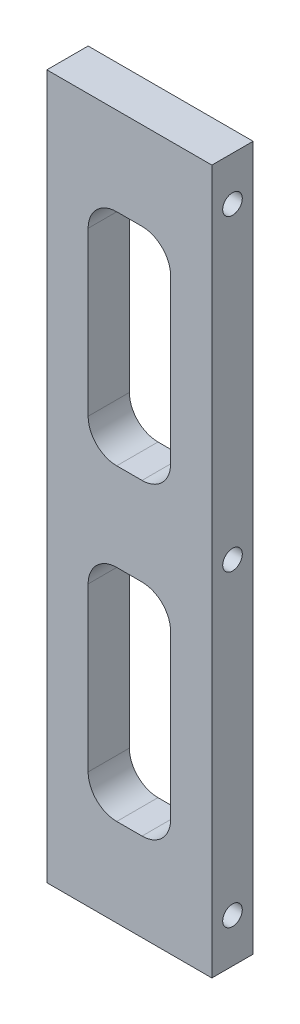
ISO-10303-21;
HEADER;
FILE_DESCRIPTION(('STEP AP214'),'2;1');
FILE_NAME('part.step','',(''),(''),'','','');
FILE_SCHEMA(('AUTOMOTIVE_DESIGN { 1 0 10303 214 1 1 1 1 }'));
ENDSEC;
DATA;
#1=APPLICATION_CONTEXT('core data for automotive mechanical design processes');
#2=APPLICATION_PROTOCOL_DEFINITION('international standard','automotive_design',2000,#1);
#3=PRODUCT_CONTEXT('',#1,'mechanical');
#4=PRODUCT('Part','Part','',(#3));
#5=PRODUCT_RELATED_PRODUCT_CATEGORY('part','',(#4));
#6=PRODUCT_DEFINITION_FORMATION('','',#4);
#7=PRODUCT_DEFINITION_CONTEXT('part definition',#1,'design');
#8=PRODUCT_DEFINITION('design','',#6,#7);
#9=PRODUCT_DEFINITION_SHAPE('','',#8);
#10=(LENGTH_UNIT() NAMED_UNIT(*) SI_UNIT(.MILLI.,.METRE.));
#11=(NAMED_UNIT(*) PLANE_ANGLE_UNIT() SI_UNIT($,.RADIAN.));
#12=(NAMED_UNIT(*) SI_UNIT($,.STERADIAN.) SOLID_ANGLE_UNIT());
#13=UNCERTAINTY_MEASURE_WITH_UNIT(LENGTH_MEASURE(1.E-05),#10,'distance_accuracy_value','');
#14=(GEOMETRIC_REPRESENTATION_CONTEXT(3) GLOBAL_UNCERTAINTY_ASSIGNED_CONTEXT((#13)) GLOBAL_UNIT_ASSIGNED_CONTEXT((#10,
#11,#12)) REPRESENTATION_CONTEXT('',''));
#15=CARTESIAN_POINT('',(0.,0.,0.));
#16=DIRECTION('',(0.,0.,1.));
#17=DIRECTION('',(1.,0.,0.));
#18=AXIS2_PLACEMENT_3D('',#15,#16,#17);
#19=CARTESIAN_POINT('',(9.525,-40.64,4.7625));
#20=DIRECTION('',(-1.,0.,0.));
#21=DIRECTION('',(0.,0.,1.));
#22=AXIS2_PLACEMENT_3D('',#19,#20,#21);
#23=PLANE('',#22);
#24=CARTESIAN_POINT('',(9.525,35.56,2.38125));
#25=DIRECTION('',(1.,0.,0.));
#26=DIRECTION('',(0.,0.,-1.));
#27=AXIS2_PLACEMENT_3D('',#24,#25,#26);
#28=CIRCLE('',#27,1.13029999999999);
#29=CARTESIAN_POINT('',(9.525,35.56,1.25095000000001));
#30=VERTEX_POINT('',#29);
#31=EDGE_CURVE('E423',#30,#30,#28,.T.);
#32=ORIENTED_EDGE('',*,*,#31,.F.);
#33=EDGE_LOOP('',(#32));
#34=FACE_BOUND('',#33,.T.);
#35=CARTESIAN_POINT('',(9.525,0.,2.38125));
#36=DIRECTION('',(1.,0.,0.));
#37=DIRECTION('',(0.,0.,-1.));
#38=AXIS2_PLACEMENT_3D('',#35,#36,#37);
#39=CIRCLE('',#38,1.13029999999999);
#40=CARTESIAN_POINT('',(9.525,0.,1.25095000000001));
#41=VERTEX_POINT('',#40);
#42=EDGE_CURVE('E418',#41,#41,#39,.T.);
#43=ORIENTED_EDGE('',*,*,#42,.F.);
#44=EDGE_LOOP('',(#43));
#45=FACE_BOUND('',#44,.T.);
#46=CARTESIAN_POINT('',(9.525,-35.56,2.38124999999999));
#47=DIRECTION('',(1.,0.,0.));
#48=DIRECTION('',(0.,0.,-1.));
#49=AXIS2_PLACEMENT_3D('',#46,#47,#48);
#50=CIRCLE('',#49,1.13029999999999);
#51=CARTESIAN_POINT('',(9.525,-35.56,1.25095));
#52=VERTEX_POINT('',#51);
#53=EDGE_CURVE('E412',#52,#52,#50,.T.);
#54=ORIENTED_EDGE('',*,*,#53,.F.);
#55=EDGE_LOOP('',(#54));
#56=FACE_BOUND('',#55,.T.);
#57=DIRECTION('',(0.,1.,0.));
#58=VECTOR('',#57,1.);
#59=CARTESIAN_POINT('',(9.525,-40.64,0.));
#60=LINE('',#59,#58);
#61=CARTESIAN_POINT('',(9.525,-40.64,0.));
#62=VERTEX_POINT('',#61);
#63=CARTESIAN_POINT('',(9.525,40.64,0.));
#64=VERTEX_POINT('',#63);
#65=EDGE_CURVE('E196',#62,#64,#60,.T.);
#66=ORIENTED_EDGE('',*,*,#65,.T.);
#67=DIRECTION('',(0.,0.,-1.));
#68=VECTOR('',#67,1.);
#69=CARTESIAN_POINT('',(9.525,40.64,4.7625));
#70=LINE('',#69,#68);
#71=CARTESIAN_POINT('',(9.525,40.64,4.7625));
#72=VERTEX_POINT('',#71);
#73=EDGE_CURVE('E177',#72,#64,#70,.T.);
#74=ORIENTED_EDGE('',*,*,#73,.F.);
#75=DIRECTION('',(0.,1.,0.));
#76=VECTOR('',#75,1.);
#77=CARTESIAN_POINT('',(9.525,-40.64,4.7625));
#78=LINE('',#77,#76);
#79=CARTESIAN_POINT('',(9.525,-40.64,4.7625));
#80=VERTEX_POINT('',#79);
#81=EDGE_CURVE('E184',#80,#72,#78,.T.);
#82=ORIENTED_EDGE('',*,*,#81,.F.);
#83=DIRECTION('',(0.,0.,-1.));
#84=VECTOR('',#83,1.);
#85=CARTESIAN_POINT('',(9.525,-40.64,4.7625));
#86=LINE('',#85,#84);
#87=EDGE_CURVE('E307',#80,#62,#86,.T.);
#88=ORIENTED_EDGE('',*,*,#87,.T.);
#89=EDGE_LOOP('',(#66,#74,#82,#88));
#90=FACE_BOUND('',#89,.T.);
#91=ADVANCED_FACE('F35',(#34,#45,#56,#90),#23,.F.);
#92=CARTESIAN_POINT('',(-9.525,40.64,4.7625));
#93=DIRECTION('',(0.,-1.,0.));
#94=DIRECTION('',(0.,0.,-1.));
#95=AXIS2_PLACEMENT_3D('',#92,#93,#94);
#96=PLANE('',#95);
#97=DIRECTION('',(-1.,0.,0.));
#98=VECTOR('',#97,1.);
#99=CARTESIAN_POINT('',(-9.525,40.64,0.));
#100=LINE('',#99,#98);
#101=CARTESIAN_POINT('',(-9.525,40.64,0.));
#102=VERTEX_POINT('',#101);
#103=EDGE_CURVE('E309',#64,#102,#100,.T.);
#104=ORIENTED_EDGE('',*,*,#103,.T.);
#105=DIRECTION('',(0.,0.,-1.));
#106=VECTOR('',#105,1.);
#107=CARTESIAN_POINT('',(-9.525,40.64,4.7625));
#108=LINE('',#107,#106);
#109=CARTESIAN_POINT('',(-9.525,40.64,4.7625));
#110=VERTEX_POINT('',#109);
#111=EDGE_CURVE('E180',#110,#102,#108,.T.);
#112=ORIENTED_EDGE('',*,*,#111,.F.);
#113=DIRECTION('',(-1.,0.,0.));
#114=VECTOR('',#113,1.);
#115=CARTESIAN_POINT('',(-9.525,40.64,4.7625));
#116=LINE('',#115,#114);
#117=EDGE_CURVE('E173',#72,#110,#116,.T.);
#118=ORIENTED_EDGE('',*,*,#117,.F.);
#119=ORIENTED_EDGE('',*,*,#73,.T.);
#120=EDGE_LOOP('',(#104,#112,#118,#119));
#121=FACE_BOUND('',#120,.T.);
#122=ADVANCED_FACE('F175',(#121),#96,.F.);
#123=CARTESIAN_POINT('',(-9.525,-40.64,4.7625));
#124=DIRECTION('',(1.,0.,0.));
#125=DIRECTION('',(0.,0.,-1.));
#126=AXIS2_PLACEMENT_3D('',#123,#124,#125);
#127=PLANE('',#126);
#128=CARTESIAN_POINT('',(-9.525,35.56,2.38125));
#129=DIRECTION('',(1.,0.,0.));
#130=DIRECTION('',(0.,0.,-1.));
#131=AXIS2_PLACEMENT_3D('',#128,#129,#130);
#132=CIRCLE('',#131,1.13029999999999);
#133=CARTESIAN_POINT('',(-9.525,35.56,1.25095000000001));
#134=VERTEX_POINT('',#133);
#135=EDGE_CURVE('E421',#134,#134,#132,.T.);
#136=ORIENTED_EDGE('',*,*,#135,.T.);
#137=EDGE_LOOP('',(#136));
#138=FACE_BOUND('',#137,.T.);
#139=CARTESIAN_POINT('',(-9.525,0.,2.38125));
#140=DIRECTION('',(1.,0.,0.));
#141=DIRECTION('',(0.,0.,-1.));
#142=AXIS2_PLACEMENT_3D('',#139,#140,#141);
#143=CIRCLE('',#142,1.1303);
#144=CARTESIAN_POINT('',(-9.525,0.,1.25095));
#145=VERTEX_POINT('',#144);
#146=EDGE_CURVE('E415',#145,#145,#143,.T.);
#147=ORIENTED_EDGE('',*,*,#146,.T.);
#148=EDGE_LOOP('',(#147));
#149=FACE_BOUND('',#148,.T.);
#150=CARTESIAN_POINT('',(-9.525,-35.56,2.38124999999999));
#151=DIRECTION('',(1.,0.,0.));
#152=DIRECTION('',(0.,0.,-1.));
#153=AXIS2_PLACEMENT_3D('',#150,#151,#152);
#154=CIRCLE('',#153,1.13029999999999);
#155=CARTESIAN_POINT('',(-9.525,-35.56,1.25095));
#156=VERTEX_POINT('',#155);
#157=EDGE_CURVE('E399',#156,#156,#154,.T.);
#158=ORIENTED_EDGE('',*,*,#157,.T.);
#159=EDGE_LOOP('',(#158));
#160=FACE_BOUND('',#159,.T.);
#161=DIRECTION('',(0.,-1.,0.));
#162=VECTOR('',#161,1.);
#163=CARTESIAN_POINT('',(-9.525,-40.64,0.));
#164=LINE('',#163,#162);
#165=CARTESIAN_POINT('',(-9.525,-40.64,0.));
#166=VERTEX_POINT('',#165);
#167=EDGE_CURVE('E311',#102,#166,#164,.T.);
#168=ORIENTED_EDGE('',*,*,#167,.T.);
#169=DIRECTION('',(0.,0.,-1.));
#170=VECTOR('',#169,1.);
#171=CARTESIAN_POINT('',(-9.525,-40.64,4.7625));
#172=LINE('',#171,#170);
#173=CARTESIAN_POINT('',(-9.525,-40.64,4.7625));
#174=VERTEX_POINT('',#173);
#175=EDGE_CURVE('E201',#174,#166,#172,.T.);
#176=ORIENTED_EDGE('',*,*,#175,.F.);
#177=DIRECTION('',(0.,-1.,0.));
#178=VECTOR('',#177,1.);
#179=CARTESIAN_POINT('',(-9.525,-40.64,4.7625));
#180=LINE('',#179,#178);
#181=EDGE_CURVE('E183',#110,#174,#180,.T.);
#182=ORIENTED_EDGE('',*,*,#181,.F.);
#183=ORIENTED_EDGE('',*,*,#111,.T.);
#184=EDGE_LOOP('',(#168,#176,#182,#183));
#185=FACE_BOUND('',#184,.T.);
#186=ADVANCED_FACE('F321',(#138,#149,#160,#185),#127,.F.);
#187=CARTESIAN_POINT('',(-9.525,-40.64,4.7625));
#188=DIRECTION('',(0.,1.,0.));
#189=DIRECTION('',(0.,0.,1.));
#190=AXIS2_PLACEMENT_3D('',#187,#188,#189);
#191=PLANE('',#190);
#192=DIRECTION('',(1.,0.,0.));
#193=VECTOR('',#192,1.);
#194=CARTESIAN_POINT('',(-9.525,-40.64,0.));
#195=LINE('',#194,#193);
#196=EDGE_CURVE('E193',#166,#62,#195,.T.);
#197=ORIENTED_EDGE('',*,*,#196,.T.);
#198=ORIENTED_EDGE('',*,*,#87,.F.);
#199=DIRECTION('',(1.,0.,0.));
#200=VECTOR('',#199,1.);
#201=CARTESIAN_POINT('',(-9.525,-40.64,4.7625));
#202=LINE('',#201,#200);
#203=EDGE_CURVE('E189',#174,#80,#202,.T.);
#204=ORIENTED_EDGE('',*,*,#203,.F.);
#205=ORIENTED_EDGE('',*,*,#175,.T.);
#206=EDGE_LOOP('',(#197,#198,#204,#205));
#207=FACE_BOUND('',#206,.T.);
#208=ADVANCED_FACE('F318',(#207),#191,.F.);
#209=CARTESIAN_POINT('',(0.,0.,4.7625));
#210=DIRECTION('',(0.,0.,-1.));
#211=DIRECTION('',(-1.,0.,0.));
#212=AXIS2_PLACEMENT_3D('',#209,#210,#211);
#213=PLANE('',#212);
#214=DIRECTION('',(1.,0.,0.));
#215=VECTOR('',#214,1.);
#216=CARTESIAN_POINT('',(-4.7625,-30.48,4.7625));
#217=LINE('',#216,#215);
#218=CARTESIAN_POINT('',(-1.4605,-30.48,4.7625));
#219=VERTEX_POINT('',#218);
#220=CARTESIAN_POINT('',(1.4605,-30.48,4.7625));
#221=VERTEX_POINT('',#220);
#222=EDGE_CURVE('E393',#219,#221,#217,.T.);
#223=ORIENTED_EDGE('',*,*,#222,.F.);
#224=CARTESIAN_POINT('',(-1.4605,-27.178,4.7625));
#225=DIRECTION('',(0.,0.,-1.));
#226=DIRECTION('',(-1.,0.,0.));
#227=AXIS2_PLACEMENT_3D('',#224,#225,#226);
#228=CIRCLE('',#227,3.302);
#229=CARTESIAN_POINT('',(-4.7625,-27.178,4.7625));
#230=VERTEX_POINT('',#229);
#231=EDGE_CURVE('E241',#219,#230,#228,.T.);
#232=ORIENTED_EDGE('',*,*,#231,.T.);
#233=DIRECTION('',(0.,-1.,0.));
#234=VECTOR('',#233,1.);
#235=CARTESIAN_POINT('',(-4.7625,-5.08,4.7625));
#236=LINE('',#235,#234);
#237=CARTESIAN_POINT('',(-4.7625,-8.382,4.7625));
#238=VERTEX_POINT('',#237);
#239=EDGE_CURVE('E396',#238,#230,#236,.T.);
#240=ORIENTED_EDGE('',*,*,#239,.F.);
#241=CARTESIAN_POINT('',(-1.4605,-8.382,4.7625));
#242=DIRECTION('',(0.,0.,-1.));
#243=DIRECTION('',(-1.,0.,0.));
#244=AXIS2_PLACEMENT_3D('',#241,#242,#243);
#245=CIRCLE('',#244,3.302);
#246=CARTESIAN_POINT('',(-1.4605,-5.08,4.7625));
#247=VERTEX_POINT('',#246);
#248=EDGE_CURVE('E249',#238,#247,#245,.T.);
#249=ORIENTED_EDGE('',*,*,#248,.T.);
#250=DIRECTION('',(-1.,0.,0.));
#251=VECTOR('',#250,1.);
#252=CARTESIAN_POINT('',(-4.7625,-5.08,4.7625));
#253=LINE('',#252,#251);
#254=CARTESIAN_POINT('',(1.4605,-5.08,4.7625));
#255=VERTEX_POINT('',#254);
#256=EDGE_CURVE('E386',#255,#247,#253,.T.);
#257=ORIENTED_EDGE('',*,*,#256,.F.);
#258=CARTESIAN_POINT('',(1.4605,-8.382,4.7625));
#259=DIRECTION('',(0.,0.,-1.));
#260=DIRECTION('',(-1.,0.,0.));
#261=AXIS2_PLACEMENT_3D('',#258,#259,#260);
#262=CIRCLE('',#261,3.302);
#263=CARTESIAN_POINT('',(4.7625,-8.382,4.7625));
#264=VERTEX_POINT('',#263);
#265=EDGE_CURVE('E253',#255,#264,#262,.T.);
#266=ORIENTED_EDGE('',*,*,#265,.T.);
#267=DIRECTION('',(0.,1.,0.));
#268=VECTOR('',#267,1.);
#269=CARTESIAN_POINT('',(4.7625,-5.08,4.7625));
#270=LINE('',#269,#268);
#271=CARTESIAN_POINT('',(4.7625,-27.178,4.7625));
#272=VERTEX_POINT('',#271);
#273=EDGE_CURVE('E390',#272,#264,#270,.T.);
#274=ORIENTED_EDGE('',*,*,#273,.F.);
#275=CARTESIAN_POINT('',(1.4605,-27.178,4.7625));
#276=DIRECTION('',(0.,0.,-1.));
#277=DIRECTION('',(-1.,0.,0.));
#278=AXIS2_PLACEMENT_3D('',#275,#276,#277);
#279=CIRCLE('',#278,3.302);
#280=EDGE_CURVE('E245',#272,#221,#279,.T.);
#281=ORIENTED_EDGE('',*,*,#280,.T.);
#282=EDGE_LOOP('',(#223,#232,#240,#249,#257,#266,#274,#281));
#283=FACE_BOUND('',#282,.T.);
#284=DIRECTION('',(-1.,0.,0.));
#285=VECTOR('',#284,1.);
#286=CARTESIAN_POINT('',(-4.7625,30.48,4.7625));
#287=LINE('',#286,#285);
#288=CARTESIAN_POINT('',(1.4605,30.48,4.7625));
#289=VERTEX_POINT('',#288);
#290=CARTESIAN_POINT('',(-1.4605,30.48,4.7625));
#291=VERTEX_POINT('',#290);
#292=EDGE_CURVE('E270',#289,#291,#287,.T.);
#293=ORIENTED_EDGE('',*,*,#292,.F.);
#294=CARTESIAN_POINT('',(1.4605,27.178,4.7625));
#295=DIRECTION('',(0.,0.,-1.));
#296=DIRECTION('',(-1.,0.,0.));
#297=AXIS2_PLACEMENT_3D('',#294,#295,#296);
#298=CIRCLE('',#297,3.302);
#299=CARTESIAN_POINT('',(4.7625,27.178,4.7625));
#300=VERTEX_POINT('',#299);
#301=EDGE_CURVE('E265',#289,#300,#298,.T.);
#302=ORIENTED_EDGE('',*,*,#301,.T.);
#303=DIRECTION('',(0.,1.,0.));
#304=VECTOR('',#303,1.);
#305=CARTESIAN_POINT('',(4.7625,5.08,4.7625));
#306=LINE('',#305,#304);
#307=CARTESIAN_POINT('',(4.7625,8.382,4.7625));
#308=VERTEX_POINT('',#307);
#309=EDGE_CURVE('E277',#308,#300,#306,.T.);
#310=ORIENTED_EDGE('',*,*,#309,.F.);
#311=CARTESIAN_POINT('',(1.4605,8.382,4.7625));
#312=DIRECTION('',(0.,0.,-1.));
#313=DIRECTION('',(-1.,0.,0.));
#314=AXIS2_PLACEMENT_3D('',#311,#312,#313);
#315=CIRCLE('',#314,3.302);
#316=CARTESIAN_POINT('',(1.4605,5.08,4.7625));
#317=VERTEX_POINT('',#316);
#318=EDGE_CURVE('E261',#308,#317,#315,.T.);
#319=ORIENTED_EDGE('',*,*,#318,.T.);
#320=DIRECTION('',(1.,0.,0.));
#321=VECTOR('',#320,1.);
#322=CARTESIAN_POINT('',(-4.7625,5.08,4.7625));
#323=LINE('',#322,#321);
#324=CARTESIAN_POINT('',(-1.4605,5.08,4.7625));
#325=VERTEX_POINT('',#324);
#326=EDGE_CURVE('E302',#325,#317,#323,.T.);
#327=ORIENTED_EDGE('',*,*,#326,.F.);
#328=CARTESIAN_POINT('',(-1.4605,8.382,4.7625));
#329=DIRECTION('',(0.,0.,-1.));
#330=DIRECTION('',(-1.,0.,0.));
#331=AXIS2_PLACEMENT_3D('',#328,#329,#330);
#332=CIRCLE('',#331,3.302);
#333=CARTESIAN_POINT('',(-4.7625,8.382,4.7625));
#334=VERTEX_POINT('',#333);
#335=EDGE_CURVE('E257',#325,#334,#332,.T.);
#336=ORIENTED_EDGE('',*,*,#335,.T.);
#337=DIRECTION('',(0.,-1.,0.));
#338=VECTOR('',#337,1.);
#339=CARTESIAN_POINT('',(-4.7625,5.08,4.7625));
#340=LINE('',#339,#338);
#341=CARTESIAN_POINT('',(-4.7625,27.178,4.7625));
#342=VERTEX_POINT('',#341);
#343=EDGE_CURVE('E272',#342,#334,#340,.T.);
#344=ORIENTED_EDGE('',*,*,#343,.F.);
#345=CARTESIAN_POINT('',(-1.4605,27.178,4.7625));
#346=DIRECTION('',(0.,0.,-1.));
#347=DIRECTION('',(-1.,0.,0.));
#348=AXIS2_PLACEMENT_3D('',#345,#346,#347);
#349=CIRCLE('',#348,3.302);
#350=EDGE_CURVE('E43',#342,#291,#349,.T.);
#351=ORIENTED_EDGE('',*,*,#350,.T.);
#352=EDGE_LOOP('',(#293,#302,#310,#319,#327,#336,#344,#351));
#353=FACE_BOUND('',#352,.T.);
#354=ORIENTED_EDGE('',*,*,#81,.T.);
#355=ORIENTED_EDGE('',*,*,#117,.T.);
#356=ORIENTED_EDGE('',*,*,#181,.T.);
#357=ORIENTED_EDGE('',*,*,#203,.T.);
#358=EDGE_LOOP('',(#354,#355,#356,#357));
#359=FACE_BOUND('',#358,.T.);
#360=ADVANCED_FACE('F187',(#283,#353,#359),#213,.F.);
#361=CARTESIAN_POINT('',(0.,0.,0.));
#362=DIRECTION('',(0.,0.,-1.));
#363=DIRECTION('',(-1.,0.,0.));
#364=AXIS2_PLACEMENT_3D('',#361,#362,#363);
#365=PLANE('',#364);
#366=DIRECTION('',(-1.,0.,0.));
#367=VECTOR('',#366,1.);
#368=CARTESIAN_POINT('',(-4.7625,-5.08,0.));
#369=LINE('',#368,#367);
#370=CARTESIAN_POINT('',(1.4605,-5.08,0.));
#371=VERTEX_POINT('',#370);
#372=CARTESIAN_POINT('',(-1.4605,-5.08,0.));
#373=VERTEX_POINT('',#372);
#374=EDGE_CURVE('E299',#371,#373,#369,.T.);
#375=ORIENTED_EDGE('',*,*,#374,.T.);
#376=CARTESIAN_POINT('',(-1.4605,-8.382,0.));
#377=DIRECTION('',(0.,0.,-1.));
#378=DIRECTION('',(-1.,0.,0.));
#379=AXIS2_PLACEMENT_3D('',#376,#377,#378);
#380=CIRCLE('',#379,3.302);
#381=CARTESIAN_POINT('',(-4.7625,-8.382,0.));
#382=VERTEX_POINT('',#381);
#383=EDGE_CURVE('E251',#373,#382,#380,.F.);
#384=ORIENTED_EDGE('',*,*,#383,.T.);
#385=DIRECTION('',(0.,-1.,0.));
#386=VECTOR('',#385,1.);
#387=CARTESIAN_POINT('',(-4.7625,-5.08,0.));
#388=LINE('',#387,#386);
#389=CARTESIAN_POINT('',(-4.7625,-27.178,0.));
#390=VERTEX_POINT('',#389);
#391=EDGE_CURVE('E389',#382,#390,#388,.T.);
#392=ORIENTED_EDGE('',*,*,#391,.T.);
#393=CARTESIAN_POINT('',(-1.4605,-27.178,0.));
#394=DIRECTION('',(0.,0.,-1.));
#395=DIRECTION('',(-1.,0.,0.));
#396=AXIS2_PLACEMENT_3D('',#393,#394,#395);
#397=CIRCLE('',#396,3.302);
#398=CARTESIAN_POINT('',(-1.4605,-30.48,0.));
#399=VERTEX_POINT('',#398);
#400=EDGE_CURVE('E243',#390,#399,#397,.F.);
#401=ORIENTED_EDGE('',*,*,#400,.T.);
#402=DIRECTION('',(1.,0.,0.));
#403=VECTOR('',#402,1.);
#404=CARTESIAN_POINT('',(-4.7625,-30.48,0.));
#405=LINE('',#404,#403);
#406=CARTESIAN_POINT('',(1.4605,-30.48,0.));
#407=VERTEX_POINT('',#406);
#408=EDGE_CURVE('E405',#399,#407,#405,.T.);
#409=ORIENTED_EDGE('',*,*,#408,.T.);
#410=CARTESIAN_POINT('',(1.4605,-27.178,0.));
#411=DIRECTION('',(0.,0.,-1.));
#412=DIRECTION('',(-1.,0.,0.));
#413=AXIS2_PLACEMENT_3D('',#410,#411,#412);
#414=CIRCLE('',#413,3.302);
#415=CARTESIAN_POINT('',(4.7625,-27.178,0.));
#416=VERTEX_POINT('',#415);
#417=EDGE_CURVE('E247',#407,#416,#414,.F.);
#418=ORIENTED_EDGE('',*,*,#417,.T.);
#419=DIRECTION('',(0.,1.,0.));
#420=VECTOR('',#419,1.);
#421=CARTESIAN_POINT('',(4.7625,-5.08,0.));
#422=LINE('',#421,#420);
#423=CARTESIAN_POINT('',(4.7625,-8.382,0.));
#424=VERTEX_POINT('',#423);
#425=EDGE_CURVE('E402',#416,#424,#422,.T.);
#426=ORIENTED_EDGE('',*,*,#425,.T.);
#427=CARTESIAN_POINT('',(1.4605,-8.382,0.));
#428=DIRECTION('',(0.,0.,-1.));
#429=DIRECTION('',(-1.,0.,0.));
#430=AXIS2_PLACEMENT_3D('',#427,#428,#429);
#431=CIRCLE('',#430,3.302);
#432=EDGE_CURVE('E255',#424,#371,#431,.F.);
#433=ORIENTED_EDGE('',*,*,#432,.T.);
#434=EDGE_LOOP('',(#375,#384,#392,#401,#409,#418,#426,#433));
#435=FACE_BOUND('',#434,.T.);
#436=DIRECTION('',(1.,0.,0.));
#437=VECTOR('',#436,1.);
#438=CARTESIAN_POINT('',(-4.7625,5.08,0.));
#439=LINE('',#438,#437);
#440=CARTESIAN_POINT('',(-1.4605,5.08,0.));
#441=VERTEX_POINT('',#440);
#442=CARTESIAN_POINT('',(1.4605,5.08,0.));
#443=VERTEX_POINT('',#442);
#444=EDGE_CURVE('E291',#441,#443,#439,.T.);
#445=ORIENTED_EDGE('',*,*,#444,.T.);
#446=CARTESIAN_POINT('',(1.4605,8.382,0.));
#447=DIRECTION('',(0.,0.,-1.));
#448=DIRECTION('',(-1.,0.,0.));
#449=AXIS2_PLACEMENT_3D('',#446,#447,#448);
#450=CIRCLE('',#449,3.302);
#451=CARTESIAN_POINT('',(4.7625,8.382,0.));
#452=VERTEX_POINT('',#451);
#453=EDGE_CURVE('E263',#443,#452,#450,.F.);
#454=ORIENTED_EDGE('',*,*,#453,.T.);
#455=DIRECTION('',(0.,1.,0.));
#456=VECTOR('',#455,1.);
#457=CARTESIAN_POINT('',(4.7625,5.08,0.));
#458=LINE('',#457,#456);
#459=CARTESIAN_POINT('',(4.7625,27.178,0.));
#460=VERTEX_POINT('',#459);
#461=EDGE_CURVE('E294',#452,#460,#458,.T.);
#462=ORIENTED_EDGE('',*,*,#461,.T.);
#463=CARTESIAN_POINT('',(1.4605,27.178,0.));
#464=DIRECTION('',(0.,0.,-1.));
#465=DIRECTION('',(-1.,0.,0.));
#466=AXIS2_PLACEMENT_3D('',#463,#464,#465);
#467=CIRCLE('',#466,3.302);
#468=CARTESIAN_POINT('',(1.4605,30.48,0.));
#469=VERTEX_POINT('',#468);
#470=EDGE_CURVE('E57',#460,#469,#467,.F.);
#471=ORIENTED_EDGE('',*,*,#470,.T.);
#472=DIRECTION('',(-1.,0.,0.));
#473=VECTOR('',#472,1.);
#474=CARTESIAN_POINT('',(-4.7625,30.48,0.));
#475=LINE('',#474,#473);
#476=CARTESIAN_POINT('',(-1.4605,30.48,0.));
#477=VERTEX_POINT('',#476);
#478=EDGE_CURVE('E287',#469,#477,#475,.T.);
#479=ORIENTED_EDGE('',*,*,#478,.T.);
#480=CARTESIAN_POINT('',(-1.4605,27.178,0.));
#481=DIRECTION('',(0.,0.,-1.));
#482=DIRECTION('',(-1.,0.,0.));
#483=AXIS2_PLACEMENT_3D('',#480,#481,#482);
#484=CIRCLE('',#483,3.302);
#485=CARTESIAN_POINT('',(-4.7625,27.178,0.));
#486=VERTEX_POINT('',#485);
#487=EDGE_CURVE('E11',#477,#486,#484,.F.);
#488=ORIENTED_EDGE('',*,*,#487,.T.);
#489=DIRECTION('',(0.,-1.,0.));
#490=VECTOR('',#489,1.);
#491=CARTESIAN_POINT('',(-4.7625,5.08,0.));
#492=LINE('',#491,#490);
#493=CARTESIAN_POINT('',(-4.7625,8.382,0.));
#494=VERTEX_POINT('',#493);
#495=EDGE_CURVE('E285',#486,#494,#492,.T.);
#496=ORIENTED_EDGE('',*,*,#495,.T.);
#497=CARTESIAN_POINT('',(-1.4605,8.382,0.));
#498=DIRECTION('',(0.,0.,-1.));
#499=DIRECTION('',(-1.,0.,0.));
#500=AXIS2_PLACEMENT_3D('',#497,#498,#499);
#501=CIRCLE('',#500,3.302);
#502=EDGE_CURVE('E259',#494,#441,#501,.F.);
#503=ORIENTED_EDGE('',*,*,#502,.T.);
#504=EDGE_LOOP('',(#445,#454,#462,#471,#479,#488,#496,#503));
#505=FACE_BOUND('',#504,.T.);
#506=ORIENTED_EDGE('',*,*,#65,.F.);
#507=ORIENTED_EDGE('',*,*,#196,.F.);
#508=ORIENTED_EDGE('',*,*,#167,.F.);
#509=ORIENTED_EDGE('',*,*,#103,.F.);
#510=EDGE_LOOP('',(#506,#507,#508,#509));
#511=FACE_BOUND('',#510,.T.);
#512=ADVANCED_FACE('F283',(#435,#505,#511),#365,.T.);
#513=CARTESIAN_POINT('',(4.7625,5.08,0.));
#514=DIRECTION('',(1.,0.,0.));
#515=DIRECTION('',(0.,0.,-1.));
#516=AXIS2_PLACEMENT_3D('',#513,#514,#515);
#517=PLANE('',#516);
#518=ORIENTED_EDGE('',*,*,#461,.F.);
#519=DIRECTION('',(0.,0.,1.));
#520=VECTOR('',#519,1.);
#521=CARTESIAN_POINT('',(4.7625,8.382,4.7625));
#522=LINE('',#521,#520);
#523=EDGE_CURVE('E234',#452,#308,#522,.T.);
#524=ORIENTED_EDGE('',*,*,#523,.T.);
#525=ORIENTED_EDGE('',*,*,#309,.T.);
#526=DIRECTION('',(0.,0.,1.));
#527=VECTOR('',#526,1.);
#528=CARTESIAN_POINT('',(4.7625,27.178,0.));
#529=LINE('',#528,#527);
#530=EDGE_CURVE('E232',#300,#460,#529,.F.);
#531=ORIENTED_EDGE('',*,*,#530,.T.);
#532=EDGE_LOOP('',(#518,#524,#525,#531));
#533=FACE_BOUND('',#532,.T.);
#534=ADVANCED_FACE('F376',(#533),#517,.F.);
#535=CARTESIAN_POINT('',(-4.7625,5.08,0.));
#536=DIRECTION('',(0.,-1.,0.));
#537=DIRECTION('',(0.,0.,-1.));
#538=AXIS2_PLACEMENT_3D('',#535,#536,#537);
#539=PLANE('',#538);
#540=ORIENTED_EDGE('',*,*,#444,.F.);
#541=DIRECTION('',(0.,0.,1.));
#542=VECTOR('',#541,1.);
#543=CARTESIAN_POINT('',(-1.4605,5.08,4.7625));
#544=LINE('',#543,#542);
#545=EDGE_CURVE('E224',#441,#325,#544,.T.);
#546=ORIENTED_EDGE('',*,*,#545,.T.);
#547=ORIENTED_EDGE('',*,*,#326,.T.);
#548=DIRECTION('',(0.,0.,1.));
#549=VECTOR('',#548,1.);
#550=CARTESIAN_POINT('',(1.4605,5.08,0.));
#551=LINE('',#550,#549);
#552=EDGE_CURVE('E222',#317,#443,#551,.F.);
#553=ORIENTED_EDGE('',*,*,#552,.T.);
#554=EDGE_LOOP('',(#540,#546,#547,#553));
#555=FACE_BOUND('',#554,.T.);
#556=ADVANCED_FACE('F383',(#555),#539,.F.);
#557=CARTESIAN_POINT('',(-4.7625,5.08,0.));
#558=DIRECTION('',(-1.,0.,0.));
#559=DIRECTION('',(0.,-1.,0.));
#560=AXIS2_PLACEMENT_3D('',#557,#558,#559);
#561=PLANE('',#560);
#562=ORIENTED_EDGE('',*,*,#343,.T.);
#563=DIRECTION('',(0.,0.,1.));
#564=VECTOR('',#563,1.);
#565=CARTESIAN_POINT('',(-4.7625,8.382,0.));
#566=LINE('',#565,#564);
#567=EDGE_CURVE('E230',#334,#494,#566,.F.);
#568=ORIENTED_EDGE('',*,*,#567,.T.);
#569=ORIENTED_EDGE('',*,*,#495,.F.);
#570=DIRECTION('',(0.,0.,1.));
#571=VECTOR('',#570,1.);
#572=CARTESIAN_POINT('',(-4.7625,27.178,4.7625));
#573=LINE('',#572,#571);
#574=EDGE_CURVE('E227',#486,#342,#573,.T.);
#575=ORIENTED_EDGE('',*,*,#574,.T.);
#576=EDGE_LOOP('',(#562,#568,#569,#575));
#577=FACE_BOUND('',#576,.T.);
#578=ADVANCED_FACE('F289',(#577),#561,.F.);
#579=CARTESIAN_POINT('',(-4.7625,30.48,0.));
#580=DIRECTION('',(0.,1.,0.));
#581=DIRECTION('',(0.,0.,1.));
#582=AXIS2_PLACEMENT_3D('',#579,#580,#581);
#583=PLANE('',#582);
#584=ORIENTED_EDGE('',*,*,#478,.F.);
#585=DIRECTION('',(0.,0.,1.));
#586=VECTOR('',#585,1.);
#587=CARTESIAN_POINT('',(1.4605,30.48,4.7625));
#588=LINE('',#587,#586);
#589=EDGE_CURVE('E238',#469,#289,#588,.T.);
#590=ORIENTED_EDGE('',*,*,#589,.T.);
#591=ORIENTED_EDGE('',*,*,#292,.T.);
#592=DIRECTION('',(0.,0.,1.));
#593=VECTOR('',#592,1.);
#594=CARTESIAN_POINT('',(-1.4605,30.48,0.));
#595=LINE('',#594,#593);
#596=EDGE_CURVE('E50',#291,#477,#595,.F.);
#597=ORIENTED_EDGE('',*,*,#596,.T.);
#598=EDGE_LOOP('',(#584,#590,#591,#597));
#599=FACE_BOUND('',#598,.T.);
#600=ADVANCED_FACE('F275',(#599),#583,.F.);
#601=CARTESIAN_POINT('',(-4.7625,-5.08,0.));
#602=DIRECTION('',(-1.,0.,0.));
#603=DIRECTION('',(0.,-1.,0.));
#604=AXIS2_PLACEMENT_3D('',#601,#602,#603);
#605=PLANE('',#604);
#606=ORIENTED_EDGE('',*,*,#239,.T.);
#607=DIRECTION('',(0.,0.,1.));
#608=VECTOR('',#607,1.);
#609=CARTESIAN_POINT('',(-4.7625,-27.178,0.));
#610=LINE('',#609,#608);
#611=EDGE_CURVE('E210',#230,#390,#610,.F.);
#612=ORIENTED_EDGE('',*,*,#611,.T.);
#613=ORIENTED_EDGE('',*,*,#391,.F.);
#614=DIRECTION('',(0.,0.,1.));
#615=VECTOR('',#614,1.);
#616=CARTESIAN_POINT('',(-4.7625,-8.382,4.7625));
#617=LINE('',#616,#615);
#618=EDGE_CURVE('E207',#382,#238,#617,.T.);
#619=ORIENTED_EDGE('',*,*,#618,.T.);
#620=EDGE_LOOP('',(#606,#612,#613,#619));
#621=FACE_BOUND('',#620,.T.);
#622=ADVANCED_FACE('F445',(#621),#605,.F.);
#623=CARTESIAN_POINT('',(-4.7625,-5.08,0.));
#624=DIRECTION('',(0.,1.,0.));
#625=DIRECTION('',(0.,0.,1.));
#626=AXIS2_PLACEMENT_3D('',#623,#624,#625);
#627=PLANE('',#626);
#628=ORIENTED_EDGE('',*,*,#256,.T.);
#629=DIRECTION('',(0.,0.,1.));
#630=VECTOR('',#629,1.);
#631=CARTESIAN_POINT('',(-1.4605,-5.08,0.));
#632=LINE('',#631,#630);
#633=EDGE_CURVE('E220',#247,#373,#632,.F.);
#634=ORIENTED_EDGE('',*,*,#633,.T.);
#635=ORIENTED_EDGE('',*,*,#374,.F.);
#636=DIRECTION('',(0.,0.,1.));
#637=VECTOR('',#636,1.);
#638=CARTESIAN_POINT('',(1.4605,-5.08,4.7625));
#639=LINE('',#638,#637);
#640=EDGE_CURVE('E217',#371,#255,#639,.T.);
#641=ORIENTED_EDGE('',*,*,#640,.T.);
#642=EDGE_LOOP('',(#628,#634,#635,#641));
#643=FACE_BOUND('',#642,.T.);
#644=ADVANCED_FACE('F441',(#643),#627,.F.);
#645=CARTESIAN_POINT('',(4.7625,-5.08,0.));
#646=DIRECTION('',(1.,0.,0.));
#647=DIRECTION('',(0.,0.,-1.));
#648=AXIS2_PLACEMENT_3D('',#645,#646,#647);
#649=PLANE('',#648);
#650=ORIENTED_EDGE('',*,*,#425,.F.);
#651=DIRECTION('',(0.,0.,1.));
#652=VECTOR('',#651,1.);
#653=CARTESIAN_POINT('',(4.7625,-27.178,4.7625));
#654=LINE('',#653,#652);
#655=EDGE_CURVE('E214',#416,#272,#654,.T.);
#656=ORIENTED_EDGE('',*,*,#655,.T.);
#657=ORIENTED_EDGE('',*,*,#273,.T.);
#658=DIRECTION('',(0.,0.,1.));
#659=VECTOR('',#658,1.);
#660=CARTESIAN_POINT('',(4.7625,-8.382,0.));
#661=LINE('',#660,#659);
#662=EDGE_CURVE('E212',#264,#424,#661,.F.);
#663=ORIENTED_EDGE('',*,*,#662,.T.);
#664=EDGE_LOOP('',(#650,#656,#657,#663));
#665=FACE_BOUND('',#664,.T.);
#666=ADVANCED_FACE('F444',(#665),#649,.F.);
#667=CARTESIAN_POINT('',(-4.7625,-30.48,0.));
#668=DIRECTION('',(0.,-1.,0.));
#669=DIRECTION('',(0.,0.,-1.));
#670=AXIS2_PLACEMENT_3D('',#667,#668,#669);
#671=PLANE('',#670);
#672=ORIENTED_EDGE('',*,*,#408,.F.);
#673=DIRECTION('',(0.,0.,1.));
#674=VECTOR('',#673,1.);
#675=CARTESIAN_POINT('',(-1.4605,-30.48,4.7625));
#676=LINE('',#675,#674);
#677=EDGE_CURVE('E199',#399,#219,#676,.T.);
#678=ORIENTED_EDGE('',*,*,#677,.T.);
#679=ORIENTED_EDGE('',*,*,#222,.T.);
#680=DIRECTION('',(0.,0.,1.));
#681=VECTOR('',#680,1.);
#682=CARTESIAN_POINT('',(1.4605,-30.48,0.));
#683=LINE('',#682,#681);
#684=EDGE_CURVE('E197',#221,#407,#683,.F.);
#685=ORIENTED_EDGE('',*,*,#684,.T.);
#686=EDGE_LOOP('',(#672,#678,#679,#685));
#687=FACE_BOUND('',#686,.T.);
#688=ADVANCED_FACE('F345',(#687),#671,.F.);
#689=CARTESIAN_POINT('',(-1.4605,-27.178,0.));
#690=DIRECTION('',(0.,0.,-1.));
#691=DIRECTION('',(-1.,0.,0.));
#692=AXIS2_PLACEMENT_3D('',#689,#690,#691);
#693=CYLINDRICAL_SURFACE('',#692,3.302);
#694=ORIENTED_EDGE('',*,*,#400,.F.);
#695=ORIENTED_EDGE('',*,*,#611,.F.);
#696=ORIENTED_EDGE('',*,*,#231,.F.);
#697=ORIENTED_EDGE('',*,*,#677,.F.);
#698=EDGE_LOOP('',(#694,#695,#696,#697));
#699=FACE_BOUND('',#698,.T.);
#700=ADVANCED_FACE('F341',(#699),#693,.F.);
#701=CARTESIAN_POINT('',(1.4605,-27.178,0.));
#702=DIRECTION('',(0.,0.,-1.));
#703=DIRECTION('',(-1.,0.,0.));
#704=AXIS2_PLACEMENT_3D('',#701,#702,#703);
#705=CYLINDRICAL_SURFACE('',#704,3.302);
#706=ORIENTED_EDGE('',*,*,#417,.F.);
#707=ORIENTED_EDGE('',*,*,#684,.F.);
#708=ORIENTED_EDGE('',*,*,#280,.F.);
#709=ORIENTED_EDGE('',*,*,#655,.F.);
#710=EDGE_LOOP('',(#706,#707,#708,#709));
#711=FACE_BOUND('',#710,.T.);
#712=ADVANCED_FACE('F344',(#711),#705,.F.);
#713=CARTESIAN_POINT('',(-1.4605,-8.382,0.));
#714=DIRECTION('',(0.,0.,-1.));
#715=DIRECTION('',(-1.,0.,0.));
#716=AXIS2_PLACEMENT_3D('',#713,#714,#715);
#717=CYLINDRICAL_SURFACE('',#716,3.302);
#718=ORIENTED_EDGE('',*,*,#383,.F.);
#719=ORIENTED_EDGE('',*,*,#633,.F.);
#720=ORIENTED_EDGE('',*,*,#248,.F.);
#721=ORIENTED_EDGE('',*,*,#618,.F.);
#722=EDGE_LOOP('',(#718,#719,#720,#721));
#723=FACE_BOUND('',#722,.T.);
#724=ADVANCED_FACE('F349',(#723),#717,.F.);
#725=CARTESIAN_POINT('',(1.4605,-8.382,0.));
#726=DIRECTION('',(0.,0.,-1.));
#727=DIRECTION('',(-1.,0.,0.));
#728=AXIS2_PLACEMENT_3D('',#725,#726,#727);
#729=CYLINDRICAL_SURFACE('',#728,3.302);
#730=ORIENTED_EDGE('',*,*,#432,.F.);
#731=ORIENTED_EDGE('',*,*,#662,.F.);
#732=ORIENTED_EDGE('',*,*,#265,.F.);
#733=ORIENTED_EDGE('',*,*,#640,.F.);
#734=EDGE_LOOP('',(#730,#731,#732,#733));
#735=FACE_BOUND('',#734,.T.);
#736=ADVANCED_FACE('F353',(#735),#729,.F.);
#737=CARTESIAN_POINT('',(-1.4605,8.382,0.));
#738=DIRECTION('',(0.,0.,-1.));
#739=DIRECTION('',(-1.,0.,0.));
#740=AXIS2_PLACEMENT_3D('',#737,#738,#739);
#741=CYLINDRICAL_SURFACE('',#740,3.302);
#742=ORIENTED_EDGE('',*,*,#502,.F.);
#743=ORIENTED_EDGE('',*,*,#567,.F.);
#744=ORIENTED_EDGE('',*,*,#335,.F.);
#745=ORIENTED_EDGE('',*,*,#545,.F.);
#746=EDGE_LOOP('',(#742,#743,#744,#745));
#747=FACE_BOUND('',#746,.T.);
#748=ADVANCED_FACE('F357',(#747),#741,.F.);
#749=CARTESIAN_POINT('',(1.4605,8.382,0.));
#750=DIRECTION('',(0.,0.,-1.));
#751=DIRECTION('',(-1.,0.,0.));
#752=AXIS2_PLACEMENT_3D('',#749,#750,#751);
#753=CYLINDRICAL_SURFACE('',#752,3.302);
#754=ORIENTED_EDGE('',*,*,#453,.F.);
#755=ORIENTED_EDGE('',*,*,#552,.F.);
#756=ORIENTED_EDGE('',*,*,#318,.F.);
#757=ORIENTED_EDGE('',*,*,#523,.F.);
#758=EDGE_LOOP('',(#754,#755,#756,#757));
#759=FACE_BOUND('',#758,.T.);
#760=ADVANCED_FACE('F361',(#759),#753,.F.);
#761=CARTESIAN_POINT('',(1.4605,27.178,0.));
#762=DIRECTION('',(0.,0.,-1.));
#763=DIRECTION('',(-1.,0.,0.));
#764=AXIS2_PLACEMENT_3D('',#761,#762,#763);
#765=CYLINDRICAL_SURFACE('',#764,3.302);
#766=ORIENTED_EDGE('',*,*,#470,.F.);
#767=ORIENTED_EDGE('',*,*,#530,.F.);
#768=ORIENTED_EDGE('',*,*,#301,.F.);
#769=ORIENTED_EDGE('',*,*,#589,.F.);
#770=EDGE_LOOP('',(#766,#767,#768,#769));
#771=FACE_BOUND('',#770,.T.);
#772=ADVANCED_FACE('F364',(#771),#765,.F.);
#773=CARTESIAN_POINT('',(-1.4605,27.178,0.));
#774=DIRECTION('',(0.,0.,-1.));
#775=DIRECTION('',(-1.,0.,0.));
#776=AXIS2_PLACEMENT_3D('',#773,#774,#775);
#777=CYLINDRICAL_SURFACE('',#776,3.302);
#778=ORIENTED_EDGE('',*,*,#487,.F.);
#779=ORIENTED_EDGE('',*,*,#596,.F.);
#780=ORIENTED_EDGE('',*,*,#350,.F.);
#781=ORIENTED_EDGE('',*,*,#574,.F.);
#782=EDGE_LOOP('',(#778,#779,#780,#781));
#783=FACE_BOUND('',#782,.T.);
#784=ADVANCED_FACE('F37',(#783),#777,.F.);
#785=CARTESIAN_POINT('',(9.525,-35.56,2.38124999999999));
#786=DIRECTION('',(1.,0.,0.));
#787=DIRECTION('',(0.,0.,-1.));
#788=AXIS2_PLACEMENT_3D('',#785,#786,#787);
#789=CYLINDRICAL_SURFACE('',#788,1.13029999999999);
#790=ORIENTED_EDGE('',*,*,#157,.F.);
#791=EDGE_LOOP('',(#790));
#792=FACE_BOUND('',#791,.T.);
#793=ORIENTED_EDGE('',*,*,#53,.T.);
#794=EDGE_LOOP('',(#793));
#795=FACE_BOUND('',#794,.T.);
#796=ADVANCED_FACE('F371',(#792,#795),#789,.F.);
#797=CARTESIAN_POINT('',(9.525,0.,2.38125));
#798=DIRECTION('',(1.,0.,0.));
#799=DIRECTION('',(0.,0.,-1.));
#800=AXIS2_PLACEMENT_3D('',#797,#798,#799);
#801=CYLINDRICAL_SURFACE('',#800,1.13029999999999);
#802=ORIENTED_EDGE('',*,*,#146,.F.);
#803=EDGE_LOOP('',(#802));
#804=FACE_BOUND('',#803,.T.);
#805=ORIENTED_EDGE('',*,*,#42,.T.);
#806=EDGE_LOOP('',(#805));
#807=FACE_BOUND('',#806,.T.);
#808=ADVANCED_FACE('F428',(#804,#807),#801,.F.);
#809=CARTESIAN_POINT('',(9.525,35.56,2.38125));
#810=DIRECTION('',(1.,0.,0.));
#811=DIRECTION('',(0.,0.,-1.));
#812=AXIS2_PLACEMENT_3D('',#809,#810,#811);
#813=CYLINDRICAL_SURFACE('',#812,1.13029999999999);
#814=ORIENTED_EDGE('',*,*,#135,.F.);
#815=EDGE_LOOP('',(#814));
#816=FACE_BOUND('',#815,.T.);
#817=ORIENTED_EDGE('',*,*,#31,.T.);
#818=EDGE_LOOP('',(#817));
#819=FACE_BOUND('',#818,.T.);
#820=ADVANCED_FACE('F426',(#816,#819),#813,.F.);
#821=CLOSED_SHELL('',(#91,#122,#186,#208,#360,#512,#534,#556,#578,#600,#622,#644,#666,#688,#700,
#712,#724,#736,#748,#760,#772,#784,#796,#808,#820));
#822=MANIFOLD_SOLID_BREP('B2',#821);
#823=ADVANCED_BREP_SHAPE_REPRESENTATION('',(#18,#822),#14);
#824=SHAPE_DEFINITION_REPRESENTATION(#9,#823);
ENDSEC;
END-ISO-10303-21;
